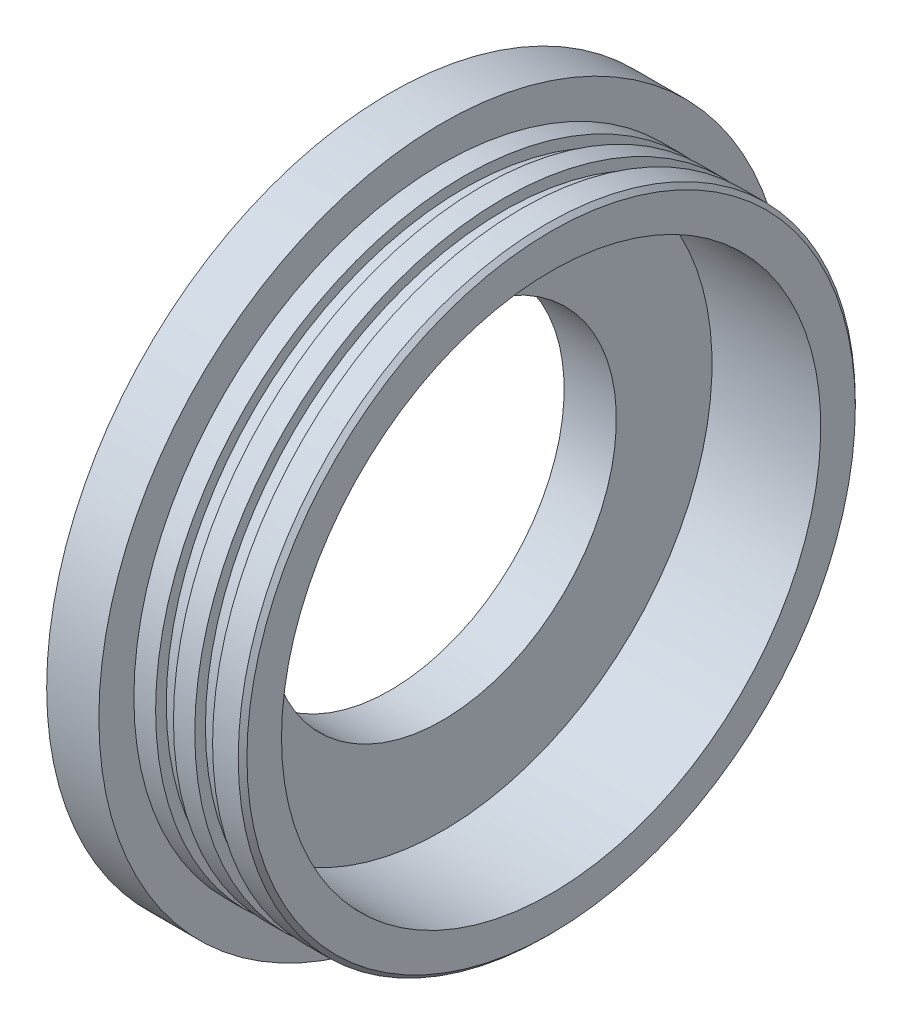
ISO-10303-21;
HEADER;
FILE_DESCRIPTION(('STEP AP214'),'2;1');
FILE_NAME('part.step','',(''),(''),'','','');
FILE_SCHEMA(('AUTOMOTIVE_DESIGN { 1 0 10303 214 1 1 1 1 }'));
ENDSEC;
DATA;
#1=APPLICATION_CONTEXT('core data for automotive mechanical design processes');
#2=APPLICATION_PROTOCOL_DEFINITION('international standard','automotive_design',2000,#1);
#3=PRODUCT_CONTEXT('',#1,'mechanical');
#4=PRODUCT('Part','Part','',(#3));
#5=PRODUCT_RELATED_PRODUCT_CATEGORY('part','',(#4));
#6=PRODUCT_DEFINITION_FORMATION('','',#4);
#7=PRODUCT_DEFINITION_CONTEXT('part definition',#1,'design');
#8=PRODUCT_DEFINITION('design','',#6,#7);
#9=PRODUCT_DEFINITION_SHAPE('','',#8);
#10=(LENGTH_UNIT() NAMED_UNIT(*) SI_UNIT(.MILLI.,.METRE.));
#11=(NAMED_UNIT(*) PLANE_ANGLE_UNIT() SI_UNIT($,.RADIAN.));
#12=(NAMED_UNIT(*) SI_UNIT($,.STERADIAN.) SOLID_ANGLE_UNIT());
#13=UNCERTAINTY_MEASURE_WITH_UNIT(LENGTH_MEASURE(1.E-05),#10,'distance_accuracy_value','');
#14=(GEOMETRIC_REPRESENTATION_CONTEXT(3) GLOBAL_UNCERTAINTY_ASSIGNED_CONTEXT((#13)) GLOBAL_UNIT_ASSIGNED_CONTEXT((#10,
#11,#12)) REPRESENTATION_CONTEXT('',''));
#15=CARTESIAN_POINT('',(0.,0.,0.));
#16=DIRECTION('',(0.,0.,1.));
#17=DIRECTION('',(1.,0.,0.));
#18=AXIS2_PLACEMENT_3D('',#15,#16,#17);
#19=CARTESIAN_POINT('',(-12.,40.,0.));
#20=DIRECTION('',(1.,0.,0.));
#21=DIRECTION('',(0.,0.,-1.));
#22=AXIS2_PLACEMENT_3D('',#19,#20,#21);
#23=PLANE('',#22);
#24=CARTESIAN_POINT('',(-12.,0.,0.));
#25=DIRECTION('',(-1.,0.,0.));
#26=DIRECTION('',(0.,0.,1.));
#27=AXIS2_PLACEMENT_3D('',#24,#25,#26);
#28=CIRCLE('',#27,42.5);
#29=CARTESIAN_POINT('',(-12.,0.,42.5));
#30=VERTEX_POINT('',#29);
#31=EDGE_CURVE('E129',#30,#30,#28,.T.);
#32=ORIENTED_EDGE('',*,*,#31,.T.);
#33=EDGE_LOOP('',(#32));
#34=FACE_BOUND('',#33,.T.);
#35=CARTESIAN_POINT('',(-12.,0.,0.));
#36=DIRECTION('',(-1.,0.,0.));
#37=DIRECTION('',(0.,0.,1.));
#38=AXIS2_PLACEMENT_3D('',#35,#36,#37);
#39=CIRCLE('',#38,40.);
#40=CARTESIAN_POINT('',(-12.,0.,40.));
#41=VERTEX_POINT('',#40);
#42=EDGE_CURVE('E174',#41,#41,#39,.T.);
#43=ORIENTED_EDGE('',*,*,#42,.F.);
#44=EDGE_LOOP('',(#43));
#45=FACE_BOUND('',#44,.T.);
#46=ADVANCED_FACE('F47',(#34,#45),#23,.F.);
#47=CARTESIAN_POINT('',(0.,0.,0.));
#48=DIRECTION('',(-1.,0.,0.));
#49=DIRECTION('',(0.,0.,1.));
#50=AXIS2_PLACEMENT_3D('',#47,#48,#49);
#51=CYLINDRICAL_SURFACE('',#50,70.95);
#52=CARTESIAN_POINT('',(9.1,0.,0.));
#53=DIRECTION('',(-1.,0.,0.));
#54=DIRECTION('',(0.,0.,1.));
#55=AXIS2_PLACEMENT_3D('',#52,#53,#54);
#56=CIRCLE('',#55,70.95);
#57=CARTESIAN_POINT('',(9.1,0.,70.95));
#58=VERTEX_POINT('',#57);
#59=EDGE_CURVE('E147',#58,#58,#56,.T.);
#60=ORIENTED_EDGE('',*,*,#59,.F.);
#61=EDGE_LOOP('',(#60));
#62=FACE_BOUND('',#61,.T.);
#63=CARTESIAN_POINT('',(14.,0.,0.));
#64=DIRECTION('',(-1.,0.,0.));
#65=DIRECTION('',(0.,0.,1.));
#66=AXIS2_PLACEMENT_3D('',#63,#64,#65);
#67=CIRCLE('',#66,70.95);
#68=CARTESIAN_POINT('',(14.,0.,70.95));
#69=VERTEX_POINT('',#68);
#70=EDGE_CURVE('E132',#69,#69,#67,.T.);
#71=ORIENTED_EDGE('',*,*,#70,.T.);
#72=EDGE_LOOP('',(#71));
#73=FACE_BOUND('',#72,.T.);
#74=ADVANCED_FACE('F200',(#62,#73),#51,.T.);
#75=CARTESIAN_POINT('',(24.,0.,0.));
#76=DIRECTION('',(-1.,0.,0.));
#77=DIRECTION('',(0.,0.,1.));
#78=AXIS2_PLACEMENT_3D('',#75,#76,#77);
#79=CIRCLE('',#78,70.95);
#80=CARTESIAN_POINT('',(24.,0.,70.95));
#81=VERTEX_POINT('',#80);
#82=EDGE_CURVE('E56',#81,#81,#79,.T.);
#83=ORIENTED_EDGE('',*,*,#82,.T.);
#84=EDGE_LOOP('',(#83));
#85=FACE_BOUND('',#84,.T.);
#86=CARTESIAN_POINT('',(18.1,0.,0.));
#87=DIRECTION('',(-1.,0.,0.));
#88=DIRECTION('',(0.,0.,1.));
#89=AXIS2_PLACEMENT_3D('',#86,#87,#88);
#90=CIRCLE('',#89,70.95);
#91=CARTESIAN_POINT('',(18.1,0.,70.95));
#92=VERTEX_POINT('',#91);
#93=EDGE_CURVE('E135',#92,#92,#90,.T.);
#94=ORIENTED_EDGE('',*,*,#93,.F.);
#95=EDGE_LOOP('',(#94));
#96=FACE_BOUND('',#95,.T.);
#97=ADVANCED_FACE('F179',(#85,#96),#51,.T.);
#98=CARTESIAN_POINT('',(0.,0.,0.));
#99=DIRECTION('',(-1.,0.,0.));
#100=DIRECTION('',(0.,0.,1.));
#101=AXIS2_PLACEMENT_3D('',#98,#99,#100);
#102=CIRCLE('',#101,70.95);
#103=CARTESIAN_POINT('',(0.,0.,70.95));
#104=VERTEX_POINT('',#103);
#105=EDGE_CURVE('E165',#104,#104,#102,.T.);
#106=ORIENTED_EDGE('',*,*,#105,.F.);
#107=EDGE_LOOP('',(#106));
#108=FACE_BOUND('',#107,.T.);
#109=CARTESIAN_POINT('',(5.,0.,0.));
#110=DIRECTION('',(-1.,0.,0.));
#111=DIRECTION('',(0.,0.,1.));
#112=AXIS2_PLACEMENT_3D('',#109,#110,#111);
#113=CIRCLE('',#112,70.95);
#114=CARTESIAN_POINT('',(5.,0.,70.95));
#115=VERTEX_POINT('',#114);
#116=EDGE_CURVE('E144',#115,#115,#113,.T.);
#117=ORIENTED_EDGE('',*,*,#116,.T.);
#118=EDGE_LOOP('',(#117));
#119=FACE_BOUND('',#118,.T.);
#120=ADVANCED_FACE('F211',(#108,#119),#51,.T.);
#121=CARTESIAN_POINT('',(0.,0.,0.));
#122=DIRECTION('',(-1.,0.,0.));
#123=DIRECTION('',(0.,0.,1.));
#124=AXIS2_PLACEMENT_3D('',#121,#122,#123);
#125=CYLINDRICAL_SURFACE('',#124,40.);
#126=CARTESIAN_POINT('',(0.,0.,0.));
#127=DIRECTION('',(-1.,0.,0.));
#128=DIRECTION('',(0.,0.,1.));
#129=AXIS2_PLACEMENT_3D('',#126,#127,#128);
#130=CIRCLE('',#129,40.);
#131=CARTESIAN_POINT('',(0.,0.,40.));
#132=VERTEX_POINT('',#131);
#133=EDGE_CURVE('E156',#132,#132,#130,.T.);
#134=ORIENTED_EDGE('',*,*,#133,.F.);
#135=EDGE_LOOP('',(#134));
#136=FACE_BOUND('',#135,.T.);
#137=ORIENTED_EDGE('',*,*,#42,.T.);
#138=EDGE_LOOP('',(#137));
#139=FACE_BOUND('',#138,.T.);
#140=ADVANCED_FACE('F216',(#136,#139),#125,.F.);
#141=CARTESIAN_POINT('',(-12.,27.125,-46.9818781553058));
#142=DIRECTION('',(-1.,0.,0.));
#143=DIRECTION('',(0.,0.,1.));
#144=AXIS2_PLACEMENT_3D('',#141,#142,#143);
#145=CIRCLE('',#144,1.64999999999999);
#146=CARTESIAN_POINT('',(-12.,27.125,-45.3318781553058));
#147=VERTEX_POINT('',#146);
#148=EDGE_CURVE('E86',#147,#147,#145,.T.);
#149=ORIENTED_EDGE('',*,*,#148,.F.);
#150=EDGE_LOOP('',(#149));
#151=FACE_BOUND('',#150,.T.);
#152=CARTESIAN_POINT('',(-12.,-27.125,-46.9818781553058));
#153=DIRECTION('',(-1.,0.,0.));
#154=DIRECTION('',(0.,0.,1.));
#155=AXIS2_PLACEMENT_3D('',#152,#153,#154);
#156=CIRCLE('',#155,1.64999999999999);
#157=CARTESIAN_POINT('',(-12.,-27.125,-45.3318781553058));
#158=VERTEX_POINT('',#157);
#159=EDGE_CURVE('E85',#158,#158,#156,.T.);
#160=ORIENTED_EDGE('',*,*,#159,.F.);
#161=EDGE_LOOP('',(#160));
#162=FACE_BOUND('',#161,.T.);
#163=CARTESIAN_POINT('',(-12.,-54.25,0.));
#164=DIRECTION('',(-1.,0.,0.));
#165=DIRECTION('',(0.,0.,1.));
#166=AXIS2_PLACEMENT_3D('',#163,#164,#165);
#167=CIRCLE('',#166,1.64999999999999);
#168=CARTESIAN_POINT('',(-12.,-54.25,1.65));
#169=VERTEX_POINT('',#168);
#170=EDGE_CURVE('E96',#169,#169,#167,.T.);
#171=ORIENTED_EDGE('',*,*,#170,.F.);
#172=EDGE_LOOP('',(#171));
#173=FACE_BOUND('',#172,.T.);
#174=CARTESIAN_POINT('',(-12.,-27.125,46.9818781553058));
#175=DIRECTION('',(-1.,0.,0.));
#176=DIRECTION('',(0.,0.,1.));
#177=AXIS2_PLACEMENT_3D('',#174,#175,#176);
#178=CIRCLE('',#177,1.64999999999999);
#179=CARTESIAN_POINT('',(-12.,-27.125,48.6318781553058));
#180=VERTEX_POINT('',#179);
#181=EDGE_CURVE('E102',#180,#180,#178,.T.);
#182=ORIENTED_EDGE('',*,*,#181,.F.);
#183=EDGE_LOOP('',(#182));
#184=FACE_BOUND('',#183,.T.);
#185=CARTESIAN_POINT('',(-12.,27.125,46.9818781553058));
#186=DIRECTION('',(-1.,0.,0.));
#187=DIRECTION('',(0.,0.,1.));
#188=AXIS2_PLACEMENT_3D('',#185,#186,#187);
#189=CIRCLE('',#188,1.64999999999999);
#190=CARTESIAN_POINT('',(-12.,27.125,48.6318781553058));
#191=VERTEX_POINT('',#190);
#192=EDGE_CURVE('E108',#191,#191,#189,.T.);
#193=ORIENTED_EDGE('',*,*,#192,.F.);
#194=EDGE_LOOP('',(#193));
#195=FACE_BOUND('',#194,.T.);
#196=CARTESIAN_POINT('',(-12.,54.25,0.));
#197=DIRECTION('',(-1.,0.,0.));
#198=DIRECTION('',(0.,0.,1.));
#199=AXIS2_PLACEMENT_3D('',#196,#197,#198);
#200=CIRCLE('',#199,1.64999999999999);
#201=CARTESIAN_POINT('',(-12.,54.25,1.64999999999999));
#202=VERTEX_POINT('',#201);
#203=EDGE_CURVE('E114',#202,#202,#200,.T.);
#204=ORIENTED_EDGE('',*,*,#203,.F.);
#205=EDGE_LOOP('',(#204));
#206=FACE_BOUND('',#205,.T.);
#207=CARTESIAN_POINT('',(-12.,0.,0.));
#208=DIRECTION('',(-1.,0.,0.));
#209=DIRECTION('',(0.,0.,1.));
#210=AXIS2_PLACEMENT_3D('',#207,#208,#209);
#211=CIRCLE('',#210,46.6);
#212=CARTESIAN_POINT('',(-12.,0.,46.6));
#213=VERTEX_POINT('',#212);
#214=EDGE_CURVE('E120',#213,#213,#211,.T.);
#215=ORIENTED_EDGE('',*,*,#214,.F.);
#216=EDGE_LOOP('',(#215));
#217=FACE_BOUND('',#216,.T.);
#218=CARTESIAN_POINT('',(-12.,0.,0.));
#219=DIRECTION('',(-1.,0.,0.));
#220=DIRECTION('',(0.,0.,1.));
#221=AXIS2_PLACEMENT_3D('',#218,#219,#220);
#222=CIRCLE('',#221,79.);
#223=CARTESIAN_POINT('',(-12.,0.,79.));
#224=VERTEX_POINT('',#223);
#225=EDGE_CURVE('E171',#224,#224,#222,.T.);
#226=ORIENTED_EDGE('',*,*,#225,.T.);
#227=EDGE_LOOP('',(#226));
#228=FACE_BOUND('',#227,.T.);
#229=ADVANCED_FACE('F203',(#151,#162,#173,#184,#195,#206,#217,#228),#23,.F.);
#230=CARTESIAN_POINT('',(0.,0.,0.));
#231=DIRECTION('',(-1.,0.,0.));
#232=DIRECTION('',(0.,0.,1.));
#233=AXIS2_PLACEMENT_3D('',#230,#231,#232);
#234=CYLINDRICAL_SURFACE('',#233,79.);
#235=ORIENTED_EDGE('',*,*,#225,.F.);
#236=EDGE_LOOP('',(#235));
#237=FACE_BOUND('',#236,.T.);
#238=CARTESIAN_POINT('',(0.,0.,0.));
#239=DIRECTION('',(-1.,0.,0.));
#240=DIRECTION('',(0.,0.,1.));
#241=AXIS2_PLACEMENT_3D('',#238,#239,#240);
#242=CIRCLE('',#241,79.);
#243=CARTESIAN_POINT('',(0.,0.,79.));
#244=VERTEX_POINT('',#243);
#245=EDGE_CURVE('E168',#244,#244,#242,.T.);
#246=ORIENTED_EDGE('',*,*,#245,.T.);
#247=EDGE_LOOP('',(#246));
#248=FACE_BOUND('',#247,.T.);
#249=ADVANCED_FACE('F215',(#237,#248),#234,.T.);
#250=CARTESIAN_POINT('',(0.,79.,0.));
#251=DIRECTION('',(-1.,0.,0.));
#252=DIRECTION('',(0.,0.,1.));
#253=AXIS2_PLACEMENT_3D('',#250,#251,#252);
#254=PLANE('',#253);
#255=ORIENTED_EDGE('',*,*,#245,.F.);
#256=EDGE_LOOP('',(#255));
#257=FACE_BOUND('',#256,.T.);
#258=ORIENTED_EDGE('',*,*,#105,.T.);
#259=EDGE_LOOP('',(#258));
#260=FACE_BOUND('',#259,.T.);
#261=ADVANCED_FACE('F223',(#257,#260),#254,.F.);
#262=CARTESIAN_POINT('',(25.,70.95,0.));
#263=DIRECTION('',(-1.,0.,0.));
#264=DIRECTION('',(0.,0.,1.));
#265=AXIS2_PLACEMENT_3D('',#262,#263,#264);
#266=PLANE('',#265);
#267=CARTESIAN_POINT('',(25.,0.,0.));
#268=DIRECTION('',(-1.,0.,0.));
#269=DIRECTION('',(0.,0.,1.));
#270=AXIS2_PLACEMENT_3D('',#267,#268,#269);
#271=CIRCLE('',#270,69.95);
#272=CARTESIAN_POINT('',(25.,0.,69.95));
#273=VERTEX_POINT('',#272);
#274=EDGE_CURVE('E11',#273,#273,#271,.F.);
#275=ORIENTED_EDGE('',*,*,#274,.T.);
#276=EDGE_LOOP('',(#275));
#277=FACE_BOUND('',#276,.T.);
#278=CARTESIAN_POINT('',(25.,0.,0.));
#279=DIRECTION('',(-1.,0.,0.));
#280=DIRECTION('',(0.,0.,1.));
#281=AXIS2_PLACEMENT_3D('',#278,#279,#280);
#282=CIRCLE('',#281,62.);
#283=CARTESIAN_POINT('',(25.,0.,62.));
#284=VERTEX_POINT('',#283);
#285=EDGE_CURVE('E162',#284,#284,#282,.T.);
#286=ORIENTED_EDGE('',*,*,#285,.T.);
#287=EDGE_LOOP('',(#286));
#288=FACE_BOUND('',#287,.T.);
#289=ADVANCED_FACE('F247',(#277,#288),#266,.F.);
#290=CARTESIAN_POINT('',(0.,0.,0.));
#291=DIRECTION('',(-1.,0.,0.));
#292=DIRECTION('',(0.,0.,1.));
#293=AXIS2_PLACEMENT_3D('',#290,#291,#292);
#294=CYLINDRICAL_SURFACE('',#293,62.);
#295=ORIENTED_EDGE('',*,*,#285,.F.);
#296=EDGE_LOOP('',(#295));
#297=FACE_BOUND('',#296,.T.);
#298=CARTESIAN_POINT('',(0.,0.,0.));
#299=DIRECTION('',(-1.,0.,0.));
#300=DIRECTION('',(0.,0.,1.));
#301=AXIS2_PLACEMENT_3D('',#298,#299,#300);
#302=CIRCLE('',#301,62.);
#303=CARTESIAN_POINT('',(0.,0.,62.));
#304=VERTEX_POINT('',#303);
#305=EDGE_CURVE('E159',#304,#304,#302,.T.);
#306=ORIENTED_EDGE('',*,*,#305,.T.);
#307=EDGE_LOOP('',(#306));
#308=FACE_BOUND('',#307,.T.);
#309=ADVANCED_FACE('F195',(#297,#308),#294,.F.);
#310=CARTESIAN_POINT('',(0.,62.,0.));
#311=DIRECTION('',(-1.,0.,0.));
#312=DIRECTION('',(0.,0.,1.));
#313=AXIS2_PLACEMENT_3D('',#310,#311,#312);
#314=PLANE('',#313);
#315=ORIENTED_EDGE('',*,*,#305,.F.);
#316=EDGE_LOOP('',(#315));
#317=FACE_BOUND('',#316,.T.);
#318=ORIENTED_EDGE('',*,*,#133,.T.);
#319=EDGE_LOOP('',(#318));
#320=FACE_BOUND('',#319,.T.);
#321=ADVANCED_FACE('F184',(#317,#320),#314,.F.);
#322=CARTESIAN_POINT('',(24.,0.,0.));
#323=DIRECTION('',(-1.,0.,0.));
#324=DIRECTION('',(0.,0.,1.));
#325=AXIS2_PLACEMENT_3D('',#322,#323,#324);
#326=CONICAL_SURFACE('',#325,70.95,0.785398163397455);
#327=ORIENTED_EDGE('',*,*,#274,.F.);
#328=EDGE_LOOP('',(#327));
#329=FACE_BOUND('',#328,.T.);
#330=ORIENTED_EDGE('',*,*,#82,.F.);
#331=EDGE_LOOP('',(#330));
#332=FACE_BOUND('',#331,.T.);
#333=ADVANCED_FACE('F50',(#329,#332),#326,.T.);
#334=CARTESIAN_POINT('',(5.,70.95,0.));
#335=DIRECTION('',(1.,0.,0.));
#336=DIRECTION('',(0.,0.,-1.));
#337=AXIS2_PLACEMENT_3D('',#334,#335,#336);
#338=PLANE('',#337);
#339=CARTESIAN_POINT('',(5.,0.,0.));
#340=DIRECTION('',(-1.,0.,0.));
#341=DIRECTION('',(0.,0.,1.));
#342=AXIS2_PLACEMENT_3D('',#339,#340,#341);
#343=CIRCLE('',#342,68.5);
#344=CARTESIAN_POINT('',(5.,0.,68.5));
#345=VERTEX_POINT('',#344);
#346=EDGE_CURVE('E153',#345,#345,#343,.T.);
#347=ORIENTED_EDGE('',*,*,#346,.T.);
#348=EDGE_LOOP('',(#347));
#349=FACE_BOUND('',#348,.T.);
#350=ORIENTED_EDGE('',*,*,#116,.F.);
#351=EDGE_LOOP('',(#350));
#352=FACE_BOUND('',#351,.T.);
#353=ADVANCED_FACE('F183',(#349,#352),#338,.T.);
#354=CARTESIAN_POINT('',(0.,0.,0.));
#355=DIRECTION('',(-1.,0.,0.));
#356=DIRECTION('',(0.,0.,1.));
#357=AXIS2_PLACEMENT_3D('',#354,#355,#356);
#358=CYLINDRICAL_SURFACE('',#357,68.5);
#359=CARTESIAN_POINT('',(9.1,0.,0.));
#360=DIRECTION('',(-1.,0.,0.));
#361=DIRECTION('',(0.,0.,1.));
#362=AXIS2_PLACEMENT_3D('',#359,#360,#361);
#363=CIRCLE('',#362,68.5);
#364=CARTESIAN_POINT('',(9.1,0.,68.5));
#365=VERTEX_POINT('',#364);
#366=EDGE_CURVE('E150',#365,#365,#363,.T.);
#367=ORIENTED_EDGE('',*,*,#366,.T.);
#368=EDGE_LOOP('',(#367));
#369=FACE_BOUND('',#368,.T.);
#370=ORIENTED_EDGE('',*,*,#346,.F.);
#371=EDGE_LOOP('',(#370));
#372=FACE_BOUND('',#371,.T.);
#373=ADVANCED_FACE('F191',(#369,#372),#358,.T.);
#374=CARTESIAN_POINT('',(9.1,68.5,0.));
#375=DIRECTION('',(-1.,0.,0.));
#376=DIRECTION('',(0.,0.,1.));
#377=AXIS2_PLACEMENT_3D('',#374,#375,#376);
#378=PLANE('',#377);
#379=ORIENTED_EDGE('',*,*,#59,.T.);
#380=EDGE_LOOP('',(#379));
#381=FACE_BOUND('',#380,.T.);
#382=ORIENTED_EDGE('',*,*,#366,.F.);
#383=EDGE_LOOP('',(#382));
#384=FACE_BOUND('',#383,.T.);
#385=ADVANCED_FACE('F265',(#381,#384),#378,.T.);
#386=CARTESIAN_POINT('',(14.,70.95,0.));
#387=DIRECTION('',(1.,0.,0.));
#388=DIRECTION('',(0.,0.,-1.));
#389=AXIS2_PLACEMENT_3D('',#386,#387,#388);
#390=PLANE('',#389);
#391=CARTESIAN_POINT('',(14.,0.,0.));
#392=DIRECTION('',(-1.,0.,0.));
#393=DIRECTION('',(0.,0.,1.));
#394=AXIS2_PLACEMENT_3D('',#391,#392,#393);
#395=CIRCLE('',#394,68.5);
#396=CARTESIAN_POINT('',(14.,0.,68.5));
#397=VERTEX_POINT('',#396);
#398=EDGE_CURVE('E141',#397,#397,#395,.T.);
#399=ORIENTED_EDGE('',*,*,#398,.T.);
#400=EDGE_LOOP('',(#399));
#401=FACE_BOUND('',#400,.T.);
#402=ORIENTED_EDGE('',*,*,#70,.F.);
#403=EDGE_LOOP('',(#402));
#404=FACE_BOUND('',#403,.T.);
#405=ADVANCED_FACE('F269',(#401,#404),#390,.T.);
#406=CARTESIAN_POINT('',(9.,0.,0.));
#407=DIRECTION('',(-1.,0.,0.));
#408=DIRECTION('',(0.,0.,1.));
#409=AXIS2_PLACEMENT_3D('',#406,#407,#408);
#410=CYLINDRICAL_SURFACE('',#409,68.5);
#411=CARTESIAN_POINT('',(18.1,0.,0.));
#412=DIRECTION('',(-1.,0.,0.));
#413=DIRECTION('',(0.,0.,1.));
#414=AXIS2_PLACEMENT_3D('',#411,#412,#413);
#415=CIRCLE('',#414,68.5);
#416=CARTESIAN_POINT('',(18.1,0.,68.5));
#417=VERTEX_POINT('',#416);
#418=EDGE_CURVE('E138',#417,#417,#415,.T.);
#419=ORIENTED_EDGE('',*,*,#418,.T.);
#420=EDGE_LOOP('',(#419));
#421=FACE_BOUND('',#420,.T.);
#422=ORIENTED_EDGE('',*,*,#398,.F.);
#423=EDGE_LOOP('',(#422));
#424=FACE_BOUND('',#423,.T.);
#425=ADVANCED_FACE('F273',(#421,#424),#410,.T.);
#426=CARTESIAN_POINT('',(18.1,68.5,0.));
#427=DIRECTION('',(-1.,0.,0.));
#428=DIRECTION('',(0.,0.,1.));
#429=AXIS2_PLACEMENT_3D('',#426,#427,#428);
#430=PLANE('',#429);
#431=ORIENTED_EDGE('',*,*,#93,.T.);
#432=EDGE_LOOP('',(#431));
#433=FACE_BOUND('',#432,.T.);
#434=ORIENTED_EDGE('',*,*,#418,.F.);
#435=EDGE_LOOP('',(#434));
#436=FACE_BOUND('',#435,.T.);
#437=ADVANCED_FACE('F277',(#433,#436),#430,.T.);
#438=CARTESIAN_POINT('',(0.,0.,0.));
#439=DIRECTION('',(-1.,0.,0.));
#440=DIRECTION('',(0.,0.,1.));
#441=AXIS2_PLACEMENT_3D('',#438,#439,#440);
#442=CYLINDRICAL_SURFACE('',#441,42.5);
#443=CARTESIAN_POINT('',(-9.6,0.,0.));
#444=DIRECTION('',(-1.,0.,0.));
#445=DIRECTION('',(0.,0.,1.));
#446=AXIS2_PLACEMENT_3D('',#443,#444,#445);
#447=CIRCLE('',#446,42.5);
#448=CARTESIAN_POINT('',(-9.6,0.,42.5));
#449=VERTEX_POINT('',#448);
#450=EDGE_CURVE('E126',#449,#449,#447,.T.);
#451=ORIENTED_EDGE('',*,*,#450,.T.);
#452=EDGE_LOOP('',(#451));
#453=FACE_BOUND('',#452,.T.);
#454=ORIENTED_EDGE('',*,*,#31,.F.);
#455=EDGE_LOOP('',(#454));
#456=FACE_BOUND('',#455,.T.);
#457=ADVANCED_FACE('F280',(#453,#456),#442,.T.);
#458=CARTESIAN_POINT('',(-9.6,42.5,0.));
#459=DIRECTION('',(-1.,0.,0.));
#460=DIRECTION('',(0.,0.,1.));
#461=AXIS2_PLACEMENT_3D('',#458,#459,#460);
#462=PLANE('',#461);
#463=CARTESIAN_POINT('',(-9.6,0.,0.));
#464=DIRECTION('',(-1.,0.,0.));
#465=DIRECTION('',(0.,0.,1.));
#466=AXIS2_PLACEMENT_3D('',#463,#464,#465);
#467=CIRCLE('',#466,46.6);
#468=CARTESIAN_POINT('',(-9.6,0.,46.6));
#469=VERTEX_POINT('',#468);
#470=EDGE_CURVE('E123',#469,#469,#467,.T.);
#471=ORIENTED_EDGE('',*,*,#470,.T.);
#472=EDGE_LOOP('',(#471));
#473=FACE_BOUND('',#472,.T.);
#474=ORIENTED_EDGE('',*,*,#450,.F.);
#475=EDGE_LOOP('',(#474));
#476=FACE_BOUND('',#475,.T.);
#477=ADVANCED_FACE('F283',(#473,#476),#462,.T.);
#478=CARTESIAN_POINT('',(0.,0.,0.));
#479=DIRECTION('',(-1.,0.,0.));
#480=DIRECTION('',(0.,0.,1.));
#481=AXIS2_PLACEMENT_3D('',#478,#479,#480);
#482=CYLINDRICAL_SURFACE('',#481,46.6);
#483=ORIENTED_EDGE('',*,*,#214,.T.);
#484=EDGE_LOOP('',(#483));
#485=FACE_BOUND('',#484,.T.);
#486=ORIENTED_EDGE('',*,*,#470,.F.);
#487=EDGE_LOOP('',(#486));
#488=FACE_BOUND('',#487,.T.);
#489=ADVANCED_FACE('F287',(#485,#488),#482,.F.);
#490=CARTESIAN_POINT('',(-2.00000000000001,54.25,0.));
#491=DIRECTION('',(-1.,0.,0.));
#492=DIRECTION('',(0.,0.,1.));
#493=AXIS2_PLACEMENT_3D('',#490,#491,#492);
#494=CONICAL_SURFACE('',#493,1.64999999999999,1.02974425867665);
#495=CARTESIAN_POINT('',(-1.00857997860453,54.25,0.));
#496=VERTEX_POINT('',#495);
#497=VERTEX_LOOP('',#496);
#498=FACE_BOUND('',#497,.T.);
#499=CARTESIAN_POINT('',(-2.00000000000001,54.25,0.));
#500=DIRECTION('',(-1.,0.,0.));
#501=DIRECTION('',(0.,0.,1.));
#502=AXIS2_PLACEMENT_3D('',#499,#500,#501);
#503=CIRCLE('',#502,1.64999999999999);
#504=CARTESIAN_POINT('',(-2.00000000000001,54.25,1.64999999999999));
#505=VERTEX_POINT('',#504);
#506=EDGE_CURVE('E117',#505,#505,#503,.T.);
#507=ORIENTED_EDGE('',*,*,#506,.T.);
#508=EDGE_LOOP('',(#507));
#509=FACE_BOUND('',#508,.T.);
#510=ADVANCED_FACE('F291',(#498,#509),#494,.F.);
#511=CARTESIAN_POINT('',(-12.,54.25,0.));
#512=DIRECTION('',(-1.,0.,0.));
#513=DIRECTION('',(0.,0.,1.));
#514=AXIS2_PLACEMENT_3D('',#511,#512,#513);
#515=CYLINDRICAL_SURFACE('',#514,1.64999999999999);
#516=ORIENTED_EDGE('',*,*,#506,.F.);
#517=EDGE_LOOP('',(#516));
#518=FACE_BOUND('',#517,.T.);
#519=ORIENTED_EDGE('',*,*,#203,.T.);
#520=EDGE_LOOP('',(#519));
#521=FACE_BOUND('',#520,.T.);
#522=ADVANCED_FACE('F295',(#518,#521),#515,.F.);
#523=CARTESIAN_POINT('',(-2.00000000000001,27.125,46.9818781553058));
#524=DIRECTION('',(-1.,0.,0.));
#525=DIRECTION('',(0.,0.,1.));
#526=AXIS2_PLACEMENT_3D('',#523,#524,#525);
#527=CONICAL_SURFACE('',#526,1.64999999999999,1.02974425867665);
#528=CARTESIAN_POINT('',(-1.00857997860453,27.125,46.9818781553058));
#529=VERTEX_POINT('',#528);
#530=VERTEX_LOOP('',#529);
#531=FACE_BOUND('',#530,.T.);
#532=CARTESIAN_POINT('',(-2.00000000000001,27.125,46.9818781553058));
#533=DIRECTION('',(-1.,0.,0.));
#534=DIRECTION('',(0.,0.,1.));
#535=AXIS2_PLACEMENT_3D('',#532,#533,#534);
#536=CIRCLE('',#535,1.64999999999999);
#537=CARTESIAN_POINT('',(-2.00000000000001,27.125,48.6318781553058));
#538=VERTEX_POINT('',#537);
#539=EDGE_CURVE('E111',#538,#538,#536,.T.);
#540=ORIENTED_EDGE('',*,*,#539,.T.);
#541=EDGE_LOOP('',(#540));
#542=FACE_BOUND('',#541,.T.);
#543=ADVANCED_FACE('F298',(#531,#542),#527,.F.);
#544=CARTESIAN_POINT('',(-12.,27.125,46.9818781553058));
#545=DIRECTION('',(-1.,0.,0.));
#546=DIRECTION('',(0.,0.,1.));
#547=AXIS2_PLACEMENT_3D('',#544,#545,#546);
#548=CYLINDRICAL_SURFACE('',#547,1.64999999999999);
#549=ORIENTED_EDGE('',*,*,#539,.F.);
#550=EDGE_LOOP('',(#549));
#551=FACE_BOUND('',#550,.T.);
#552=ORIENTED_EDGE('',*,*,#192,.T.);
#553=EDGE_LOOP('',(#552));
#554=FACE_BOUND('',#553,.T.);
#555=ADVANCED_FACE('F301',(#551,#554),#548,.F.);
#556=CARTESIAN_POINT('',(-2.00000000000001,-27.125,46.9818781553058));
#557=DIRECTION('',(-1.,0.,0.));
#558=DIRECTION('',(0.,0.,1.));
#559=AXIS2_PLACEMENT_3D('',#556,#557,#558);
#560=CONICAL_SURFACE('',#559,1.64999999999999,1.02974425867665);
#561=CARTESIAN_POINT('',(-1.00857997860453,-27.125,46.9818781553058));
#562=VERTEX_POINT('',#561);
#563=VERTEX_LOOP('',#562);
#564=FACE_BOUND('',#563,.T.);
#565=CARTESIAN_POINT('',(-2.00000000000001,-27.125,46.9818781553058));
#566=DIRECTION('',(-1.,0.,0.));
#567=DIRECTION('',(0.,0.,1.));
#568=AXIS2_PLACEMENT_3D('',#565,#566,#567);
#569=CIRCLE('',#568,1.64999999999999);
#570=CARTESIAN_POINT('',(-2.00000000000001,-27.125,48.6318781553058));
#571=VERTEX_POINT('',#570);
#572=EDGE_CURVE('E105',#571,#571,#569,.T.);
#573=ORIENTED_EDGE('',*,*,#572,.T.);
#574=EDGE_LOOP('',(#573));
#575=FACE_BOUND('',#574,.T.);
#576=ADVANCED_FACE('F304',(#564,#575),#560,.F.);
#577=CARTESIAN_POINT('',(-12.,-27.125,46.9818781553058));
#578=DIRECTION('',(-1.,0.,0.));
#579=DIRECTION('',(0.,0.,1.));
#580=AXIS2_PLACEMENT_3D('',#577,#578,#579);
#581=CYLINDRICAL_SURFACE('',#580,1.64999999999999);
#582=ORIENTED_EDGE('',*,*,#572,.F.);
#583=EDGE_LOOP('',(#582));
#584=FACE_BOUND('',#583,.T.);
#585=ORIENTED_EDGE('',*,*,#181,.T.);
#586=EDGE_LOOP('',(#585));
#587=FACE_BOUND('',#586,.T.);
#588=ADVANCED_FACE('F308',(#584,#587),#581,.F.);
#589=CARTESIAN_POINT('',(-2.00000000000001,-54.25,0.));
#590=DIRECTION('',(-1.,0.,0.));
#591=DIRECTION('',(0.,0.,1.));
#592=AXIS2_PLACEMENT_3D('',#589,#590,#591);
#593=CONICAL_SURFACE('',#592,1.64999999999999,1.02974425867665);
#594=CARTESIAN_POINT('',(-1.00857997860453,-54.25,0.));
#595=VERTEX_POINT('',#594);
#596=VERTEX_LOOP('',#595);
#597=FACE_BOUND('',#596,.T.);
#598=CARTESIAN_POINT('',(-2.00000000000001,-54.25,0.));
#599=DIRECTION('',(-1.,0.,0.));
#600=DIRECTION('',(0.,0.,1.));
#601=AXIS2_PLACEMENT_3D('',#598,#599,#600);
#602=CIRCLE('',#601,1.64999999999999);
#603=CARTESIAN_POINT('',(-2.00000000000001,-54.25,1.65));
#604=VERTEX_POINT('',#603);
#605=EDGE_CURVE('E99',#604,#604,#602,.T.);
#606=ORIENTED_EDGE('',*,*,#605,.T.);
#607=EDGE_LOOP('',(#606));
#608=FACE_BOUND('',#607,.T.);
#609=ADVANCED_FACE('F312',(#597,#608),#593,.F.);
#610=CARTESIAN_POINT('',(-12.,-54.25,0.));
#611=DIRECTION('',(-1.,0.,0.));
#612=DIRECTION('',(0.,0.,1.));
#613=AXIS2_PLACEMENT_3D('',#610,#611,#612);
#614=CYLINDRICAL_SURFACE('',#613,1.64999999999999);
#615=ORIENTED_EDGE('',*,*,#605,.F.);
#616=EDGE_LOOP('',(#615));
#617=FACE_BOUND('',#616,.T.);
#618=ORIENTED_EDGE('',*,*,#170,.T.);
#619=EDGE_LOOP('',(#618));
#620=FACE_BOUND('',#619,.T.);
#621=ADVANCED_FACE('F316',(#617,#620),#614,.F.);
#622=CARTESIAN_POINT('',(-2.00000000000001,-27.125,-46.9818781553058));
#623=DIRECTION('',(-1.,0.,0.));
#624=DIRECTION('',(0.,0.,1.));
#625=AXIS2_PLACEMENT_3D('',#622,#623,#624);
#626=CONICAL_SURFACE('',#625,1.64999999999999,1.02974425867665);
#627=CARTESIAN_POINT('',(-1.00857997860453,-27.125,-46.9818781553058));
#628=VERTEX_POINT('',#627);
#629=VERTEX_LOOP('',#628);
#630=FACE_BOUND('',#629,.T.);
#631=CARTESIAN_POINT('',(-2.00000000000001,-27.125,-46.9818781553058));
#632=DIRECTION('',(-1.,0.,0.));
#633=DIRECTION('',(0.,0.,1.));
#634=AXIS2_PLACEMENT_3D('',#631,#632,#633);
#635=CIRCLE('',#634,1.64999999999999);
#636=CARTESIAN_POINT('',(-2.00000000000001,-27.125,-45.3318781553058));
#637=VERTEX_POINT('',#636);
#638=EDGE_CURVE('E89',#637,#637,#635,.T.);
#639=ORIENTED_EDGE('',*,*,#638,.T.);
#640=EDGE_LOOP('',(#639));
#641=FACE_BOUND('',#640,.T.);
#642=ADVANCED_FACE('F320',(#630,#641),#626,.F.);
#643=CARTESIAN_POINT('',(-12.,-27.125,-46.9818781553058));
#644=DIRECTION('',(-1.,0.,0.));
#645=DIRECTION('',(0.,0.,1.));
#646=AXIS2_PLACEMENT_3D('',#643,#644,#645);
#647=CYLINDRICAL_SURFACE('',#646,1.64999999999999);
#648=ORIENTED_EDGE('',*,*,#638,.F.);
#649=EDGE_LOOP('',(#648));
#650=FACE_BOUND('',#649,.T.);
#651=ORIENTED_EDGE('',*,*,#159,.T.);
#652=EDGE_LOOP('',(#651));
#653=FACE_BOUND('',#652,.T.);
#654=ADVANCED_FACE('F79',(#650,#653),#647,.F.);
#655=CARTESIAN_POINT('',(-2.00000000000001,27.125,-46.9818781553058));
#656=DIRECTION('',(-1.,0.,0.));
#657=DIRECTION('',(0.,0.,1.));
#658=AXIS2_PLACEMENT_3D('',#655,#656,#657);
#659=CONICAL_SURFACE('',#658,1.64999999999999,1.02974425867665);
#660=CARTESIAN_POINT('',(-1.00857997860453,27.125,-46.9818781553058));
#661=VERTEX_POINT('',#660);
#662=VERTEX_LOOP('',#661);
#663=FACE_BOUND('',#662,.T.);
#664=CARTESIAN_POINT('',(-2.00000000000001,27.125,-46.9818781553058));
#665=DIRECTION('',(-1.,0.,0.));
#666=DIRECTION('',(0.,0.,1.));
#667=AXIS2_PLACEMENT_3D('',#664,#665,#666);
#668=CIRCLE('',#667,1.64999999999999);
#669=CARTESIAN_POINT('',(-2.00000000000001,27.125,-45.3318781553058));
#670=VERTEX_POINT('',#669);
#671=EDGE_CURVE('E83',#670,#670,#668,.T.);
#672=ORIENTED_EDGE('',*,*,#671,.T.);
#673=EDGE_LOOP('',(#672));
#674=FACE_BOUND('',#673,.T.);
#675=ADVANCED_FACE('F75',(#663,#674),#659,.F.);
#676=CARTESIAN_POINT('',(-12.,27.125,-46.9818781553058));
#677=DIRECTION('',(-1.,0.,0.));
#678=DIRECTION('',(0.,0.,1.));
#679=AXIS2_PLACEMENT_3D('',#676,#677,#678);
#680=CYLINDRICAL_SURFACE('',#679,1.64999999999999);
#681=ORIENTED_EDGE('',*,*,#671,.F.);
#682=EDGE_LOOP('',(#681));
#683=FACE_BOUND('',#682,.T.);
#684=ORIENTED_EDGE('',*,*,#148,.T.);
#685=EDGE_LOOP('',(#684));
#686=FACE_BOUND('',#685,.T.);
#687=ADVANCED_FACE('F78',(#683,#686),#680,.F.);
#688=CLOSED_SHELL('',(#46,#74,#97,#120,#140,#229,#249,#261,#289,#309,#321,#333,#353,#373,#385,
#405,#425,#437,#457,#477,#489,#510,#522,#543,#555,#576,#588,#609,#621,#642,#654,#675,#687));
#689=MANIFOLD_SOLID_BREP('B2',#688);
#690=ADVANCED_BREP_SHAPE_REPRESENTATION('',(#18,#689),#14);
#691=SHAPE_DEFINITION_REPRESENTATION(#9,#690);
ENDSEC;
END-ISO-10303-21;
